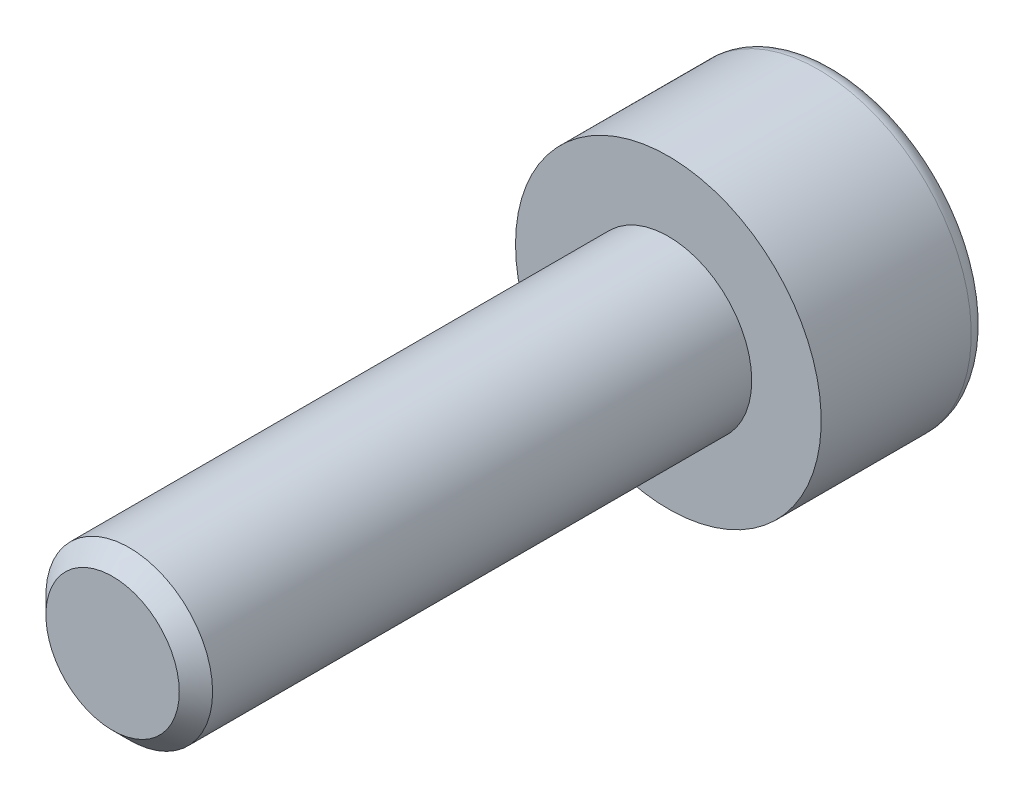
ISO-10303-21;
HEADER;
FILE_DESCRIPTION(('STEP AP214'),'2;1');
FILE_NAME('part.step','',(''),(''),'','','');
FILE_SCHEMA(('AUTOMOTIVE_DESIGN { 1 0 10303 214 1 1 1 1 }'));
ENDSEC;
DATA;
#1=APPLICATION_CONTEXT('core data for automotive mechanical design processes');
#2=APPLICATION_PROTOCOL_DEFINITION('international standard','automotive_design',2000,#1);
#3=PRODUCT_CONTEXT('',#1,'mechanical');
#4=PRODUCT('Part','Part','',(#3));
#5=PRODUCT_RELATED_PRODUCT_CATEGORY('part','',(#4));
#6=PRODUCT_DEFINITION_FORMATION('','',#4);
#7=PRODUCT_DEFINITION_CONTEXT('part definition',#1,'design');
#8=PRODUCT_DEFINITION('design','',#6,#7);
#9=PRODUCT_DEFINITION_SHAPE('','',#8);
#10=(LENGTH_UNIT() NAMED_UNIT(*) SI_UNIT(.MILLI.,.METRE.));
#11=(NAMED_UNIT(*) PLANE_ANGLE_UNIT() SI_UNIT($,.RADIAN.));
#12=(NAMED_UNIT(*) SI_UNIT($,.STERADIAN.) SOLID_ANGLE_UNIT());
#13=UNCERTAINTY_MEASURE_WITH_UNIT(LENGTH_MEASURE(1.E-05),#10,'distance_accuracy_value','');
#14=(GEOMETRIC_REPRESENTATION_CONTEXT(3) GLOBAL_UNCERTAINTY_ASSIGNED_CONTEXT((#13)) GLOBAL_UNIT_ASSIGNED_CONTEXT((#10,
#11,#12)) REPRESENTATION_CONTEXT('',''));
#15=CARTESIAN_POINT('',(0.,0.,0.));
#16=DIRECTION('',(0.,0.,1.));
#17=DIRECTION('',(1.,0.,0.));
#18=AXIS2_PLACEMENT_3D('',#15,#16,#17);
#19=CARTESIAN_POINT('',(0.,0.,-3.));
#20=DIRECTION('',(0.,0.,1.));
#21=DIRECTION('',(1.,0.,0.));
#22=AXIS2_PLACEMENT_3D('',#19,#20,#21);
#23=PLANE('',#22);
#24=CARTESIAN_POINT('',(0.,0.,-3.));
#25=DIRECTION('',(0.,0.,-1.));
#26=DIRECTION('',(-1.,0.,0.));
#27=AXIS2_PLACEMENT_3D('',#24,#25,#26);
#28=CIRCLE('',#27,2.45);
#29=CARTESIAN_POINT('',(-2.45,0.,-3.));
#30=VERTEX_POINT('',#29);
#31=EDGE_CURVE('E144',#30,#30,#28,.T.);
#32=ORIENTED_EDGE('',*,*,#31,.T.);
#33=EDGE_LOOP('',(#32));
#34=FACE_BOUND('',#33,.T.);
#35=DIRECTION('',(-0.86602540378444,0.499999999999998,0.));
#36=VECTOR('',#35,1.);
#37=CARTESIAN_POINT('',(0.,1.44337567297407,-3.));
#38=LINE('',#37,#36);
#39=CARTESIAN_POINT('',(1.25,0.721687836487036,-3.));
#40=VERTEX_POINT('',#39);
#41=CARTESIAN_POINT('',(0.,1.44337567297407,-3.));
#42=VERTEX_POINT('',#41);
#43=EDGE_CURVE('E46',#40,#42,#38,.T.);
#44=ORIENTED_EDGE('',*,*,#43,.T.);
#45=DIRECTION('',(-0.866025403784437,-0.500000000000002,0.));
#46=VECTOR('',#45,1.);
#47=CARTESIAN_POINT('',(0.,1.44337567297407,-3.));
#48=LINE('',#47,#46);
#49=CARTESIAN_POINT('',(-1.25,0.721687836487036,-3.));
#50=VERTEX_POINT('',#49);
#51=EDGE_CURVE('E117',#42,#50,#48,.T.);
#52=ORIENTED_EDGE('',*,*,#51,.T.);
#53=DIRECTION('',(0.,-1.,0.));
#54=VECTOR('',#53,1.);
#55=CARTESIAN_POINT('',(-1.25,-0.721687836487036,-3.));
#56=LINE('',#55,#54);
#57=CARTESIAN_POINT('',(-1.25,-0.721687836487036,-3.));
#58=VERTEX_POINT('',#57);
#59=EDGE_CURVE('E121',#50,#58,#56,.T.);
#60=ORIENTED_EDGE('',*,*,#59,.T.);
#61=DIRECTION('',(0.866025403784437,-0.500000000000002,0.));
#62=VECTOR('',#61,1.);
#63=CARTESIAN_POINT('',(0.,-1.44337567297407,-3.));
#64=LINE('',#63,#62);
#65=CARTESIAN_POINT('',(0.,-1.44337567297407,-3.));
#66=VERTEX_POINT('',#65);
#67=EDGE_CURVE('E124',#58,#66,#64,.T.);
#68=ORIENTED_EDGE('',*,*,#67,.T.);
#69=DIRECTION('',(0.86602540378444,0.499999999999998,0.));
#70=VECTOR('',#69,1.);
#71=CARTESIAN_POINT('',(0.,-1.44337567297407,-3.));
#72=LINE('',#71,#70);
#73=CARTESIAN_POINT('',(1.25,-0.721687836487036,-3.));
#74=VERTEX_POINT('',#73);
#75=EDGE_CURVE('E107',#66,#74,#72,.T.);
#76=ORIENTED_EDGE('',*,*,#75,.T.);
#77=DIRECTION('',(0.,1.,0.));
#78=VECTOR('',#77,1.);
#79=CARTESIAN_POINT('',(1.25,-0.721687836487036,-3.));
#80=LINE('',#79,#78);
#81=EDGE_CURVE('E127',#74,#40,#80,.T.);
#82=ORIENTED_EDGE('',*,*,#81,.T.);
#83=EDGE_LOOP('',(#44,#52,#60,#68,#76,#82));
#84=FACE_BOUND('',#83,.T.);
#85=ADVANCED_FACE('F31',(#34,#84),#23,.F.);
#86=CARTESIAN_POINT('',(0.,0.,-2.7));
#87=DIRECTION('',(0.,0.,-1.));
#88=DIRECTION('',(-1.,0.,0.));
#89=AXIS2_PLACEMENT_3D('',#86,#87,#88);
#90=TOROIDAL_SURFACE('',#89,2.45,0.299999999999999);
#91=ORIENTED_EDGE('',*,*,#31,.F.);
#92=EDGE_LOOP('',(#91));
#93=FACE_BOUND('',#92,.T.);
#94=CARTESIAN_POINT('',(0.,0.,-2.7));
#95=DIRECTION('',(0.,0.,-1.));
#96=DIRECTION('',(-1.,0.,0.));
#97=AXIS2_PLACEMENT_3D('',#94,#95,#96);
#98=CIRCLE('',#97,2.75);
#99=CARTESIAN_POINT('',(-2.75,0.,-2.7));
#100=VERTEX_POINT('',#99);
#101=EDGE_CURVE('E141',#100,#100,#98,.T.);
#102=ORIENTED_EDGE('',*,*,#101,.T.);
#103=EDGE_LOOP('',(#102));
#104=FACE_BOUND('',#103,.T.);
#105=ADVANCED_FACE('F161',(#93,#104),#90,.T.);
#106=CARTESIAN_POINT('',(0.,0.,0.));
#107=DIRECTION('',(0.,0.,-1.));
#108=DIRECTION('',(-1.,0.,0.));
#109=AXIS2_PLACEMENT_3D('',#106,#107,#108);
#110=CYLINDRICAL_SURFACE('',#109,2.75);
#111=ORIENTED_EDGE('',*,*,#101,.F.);
#112=EDGE_LOOP('',(#111));
#113=FACE_BOUND('',#112,.T.);
#114=CARTESIAN_POINT('',(0.,0.,0.));
#115=DIRECTION('',(0.,0.,-1.));
#116=DIRECTION('',(-1.,0.,0.));
#117=AXIS2_PLACEMENT_3D('',#114,#115,#116);
#118=CIRCLE('',#117,2.75);
#119=CARTESIAN_POINT('',(-2.75,0.,0.));
#120=VERTEX_POINT('',#119);
#121=EDGE_CURVE('E138',#120,#120,#118,.T.);
#122=ORIENTED_EDGE('',*,*,#121,.T.);
#123=EDGE_LOOP('',(#122));
#124=FACE_BOUND('',#123,.T.);
#125=ADVANCED_FACE('F166',(#113,#124),#110,.T.);
#126=CARTESIAN_POINT('',(0.,0.,0.));
#127=DIRECTION('',(0.,0.,-1.));
#128=DIRECTION('',(-1.,0.,0.));
#129=AXIS2_PLACEMENT_3D('',#126,#127,#128);
#130=PLANE('',#129);
#131=CARTESIAN_POINT('',(0.,0.,0.));
#132=DIRECTION('',(0.,0.,1.));
#133=DIRECTION('',(1.,0.,0.));
#134=AXIS2_PLACEMENT_3D('',#131,#132,#133);
#135=CIRCLE('',#134,1.5);
#136=CARTESIAN_POINT('',(1.5,0.,0.));
#137=VERTEX_POINT('',#136);
#138=EDGE_CURVE('E118',#137,#137,#135,.T.);
#139=ORIENTED_EDGE('',*,*,#138,.F.);
#140=EDGE_LOOP('',(#139));
#141=FACE_BOUND('',#140,.T.);
#142=ORIENTED_EDGE('',*,*,#121,.F.);
#143=EDGE_LOOP('',(#142));
#144=FACE_BOUND('',#143,.T.);
#145=ADVANCED_FACE('F173',(#141,#144),#130,.F.);
#146=CARTESIAN_POINT('',(0.,1.44337567297407,-1.7));
#147=DIRECTION('',(-0.499999999999998,-0.86602540378444,0.));
#148=DIRECTION('',(0.86602540378444,-0.499999999999998,0.));
#149=AXIS2_PLACEMENT_3D('',#146,#147,#148);
#150=PLANE('',#149);
#151=ORIENTED_EDGE('',*,*,#43,.F.);
#152=DIRECTION('',(0.,0.,-1.));
#153=VECTOR('',#152,1.);
#154=CARTESIAN_POINT('',(1.25,0.721687836487036,-1.7));
#155=LINE('',#154,#153);
#156=CARTESIAN_POINT('',(1.25,0.721687836487036,-1.7));
#157=VERTEX_POINT('',#156);
#158=EDGE_CURVE('E112',#157,#40,#155,.T.);
#159=ORIENTED_EDGE('',*,*,#158,.F.);
#160=DIRECTION('',(-0.86602540378444,0.499999999999998,0.));
#161=VECTOR('',#160,1.);
#162=CARTESIAN_POINT('',(0.,1.44337567297407,-1.7));
#163=LINE('',#162,#161);
#164=CARTESIAN_POINT('',(0.,1.44337567297407,-1.7));
#165=VERTEX_POINT('',#164);
#166=EDGE_CURVE('E130',#157,#165,#163,.T.);
#167=ORIENTED_EDGE('',*,*,#166,.T.);
#168=DIRECTION('',(0.,0.,-1.));
#169=VECTOR('',#168,1.);
#170=CARTESIAN_POINT('',(0.,1.44337567297407,-1.7));
#171=LINE('',#170,#169);
#172=EDGE_CURVE('E136',#165,#42,#171,.T.);
#173=ORIENTED_EDGE('',*,*,#172,.T.);
#174=EDGE_LOOP('',(#151,#159,#167,#173));
#175=FACE_BOUND('',#174,.T.);
#176=ADVANCED_FACE('F177',(#175),#150,.T.);
#177=CARTESIAN_POINT('',(0.,1.44337567297407,-1.7));
#178=DIRECTION('',(0.500000000000002,-0.866025403784437,0.));
#179=DIRECTION('',(0.866025403784437,0.500000000000002,0.));
#180=AXIS2_PLACEMENT_3D('',#177,#178,#179);
#181=PLANE('',#180);
#182=ORIENTED_EDGE('',*,*,#51,.F.);
#183=ORIENTED_EDGE('',*,*,#172,.F.);
#184=DIRECTION('',(-0.866025403784437,-0.500000000000002,0.));
#185=VECTOR('',#184,1.);
#186=CARTESIAN_POINT('',(0.,1.44337567297407,-1.7));
#187=LINE('',#186,#185);
#188=CARTESIAN_POINT('',(-1.25,0.721687836487036,-1.7));
#189=VERTEX_POINT('',#188);
#190=EDGE_CURVE('E85',#165,#189,#187,.T.);
#191=ORIENTED_EDGE('',*,*,#190,.T.);
#192=DIRECTION('',(0.,0.,-1.));
#193=VECTOR('',#192,1.);
#194=CARTESIAN_POINT('',(-1.25,0.721687836487036,-1.7));
#195=LINE('',#194,#193);
#196=EDGE_CURVE('E134',#189,#50,#195,.T.);
#197=ORIENTED_EDGE('',*,*,#196,.T.);
#198=EDGE_LOOP('',(#182,#183,#191,#197));
#199=FACE_BOUND('',#198,.T.);
#200=ADVANCED_FACE('F181',(#199),#181,.T.);
#201=CARTESIAN_POINT('',(-1.25,-0.721687836487036,-1.7));
#202=DIRECTION('',(1.,0.,0.));
#203=DIRECTION('',(0.,0.,-1.));
#204=AXIS2_PLACEMENT_3D('',#201,#202,#203);
#205=PLANE('',#204);
#206=ORIENTED_EDGE('',*,*,#59,.F.);
#207=ORIENTED_EDGE('',*,*,#196,.F.);
#208=DIRECTION('',(0.,-1.,0.));
#209=VECTOR('',#208,1.);
#210=CARTESIAN_POINT('',(-1.25,-0.721687836487036,-1.7));
#211=LINE('',#210,#209);
#212=CARTESIAN_POINT('',(-1.25,-0.721687836487036,-1.7));
#213=VERTEX_POINT('',#212);
#214=EDGE_CURVE('E103',#189,#213,#211,.T.);
#215=ORIENTED_EDGE('',*,*,#214,.T.);
#216=DIRECTION('',(0.,0.,-1.));
#217=VECTOR('',#216,1.);
#218=CARTESIAN_POINT('',(-1.25,-0.721687836487036,-1.7));
#219=LINE('',#218,#217);
#220=EDGE_CURVE('E100',#213,#58,#219,.T.);
#221=ORIENTED_EDGE('',*,*,#220,.T.);
#222=EDGE_LOOP('',(#206,#207,#215,#221));
#223=FACE_BOUND('',#222,.T.);
#224=ADVANCED_FACE('F184',(#223),#205,.T.);
#225=CARTESIAN_POINT('',(0.,-1.44337567297407,-1.7));
#226=DIRECTION('',(0.500000000000002,0.866025403784437,0.));
#227=DIRECTION('',(-0.866025403784437,0.500000000000002,0.));
#228=AXIS2_PLACEMENT_3D('',#225,#226,#227);
#229=PLANE('',#228);
#230=ORIENTED_EDGE('',*,*,#67,.F.);
#231=ORIENTED_EDGE('',*,*,#220,.F.);
#232=DIRECTION('',(0.866025403784437,-0.500000000000002,0.));
#233=VECTOR('',#232,1.);
#234=CARTESIAN_POINT('',(0.,-1.44337567297407,-1.7));
#235=LINE('',#234,#233);
#236=CARTESIAN_POINT('',(0.,-1.44337567297407,-1.7));
#237=VERTEX_POINT('',#236);
#238=EDGE_CURVE('E95',#213,#237,#235,.T.);
#239=ORIENTED_EDGE('',*,*,#238,.T.);
#240=DIRECTION('',(0.,0.,-1.));
#241=VECTOR('',#240,1.);
#242=CARTESIAN_POINT('',(0.,-1.44337567297407,-1.7));
#243=LINE('',#242,#241);
#244=EDGE_CURVE('E99',#237,#66,#243,.T.);
#245=ORIENTED_EDGE('',*,*,#244,.T.);
#246=EDGE_LOOP('',(#230,#231,#239,#245));
#247=FACE_BOUND('',#246,.T.);
#248=ADVANCED_FACE('F98',(#247),#229,.T.);
#249=CARTESIAN_POINT('',(0.,-1.44337567297407,-1.7));
#250=DIRECTION('',(-0.499999999999998,0.86602540378444,0.));
#251=DIRECTION('',(-0.86602540378444,-0.499999999999998,0.));
#252=AXIS2_PLACEMENT_3D('',#249,#250,#251);
#253=PLANE('',#252);
#254=ORIENTED_EDGE('',*,*,#75,.F.);
#255=ORIENTED_EDGE('',*,*,#244,.F.);
#256=DIRECTION('',(0.86602540378444,0.499999999999998,0.));
#257=VECTOR('',#256,1.);
#258=CARTESIAN_POINT('',(0.,-1.44337567297407,-1.7));
#259=LINE('',#258,#257);
#260=CARTESIAN_POINT('',(1.25,-0.721687836487036,-1.7));
#261=VERTEX_POINT('',#260);
#262=EDGE_CURVE('E102',#237,#261,#259,.T.);
#263=ORIENTED_EDGE('',*,*,#262,.T.);
#264=DIRECTION('',(0.,0.,-1.));
#265=VECTOR('',#264,1.);
#266=CARTESIAN_POINT('',(1.25,-0.721687836487036,-1.7));
#267=LINE('',#266,#265);
#268=EDGE_CURVE('E76',#261,#74,#267,.T.);
#269=ORIENTED_EDGE('',*,*,#268,.T.);
#270=EDGE_LOOP('',(#254,#255,#263,#269));
#271=FACE_BOUND('',#270,.T.);
#272=ADVANCED_FACE('F105',(#271),#253,.T.);
#273=CARTESIAN_POINT('',(1.25,-0.721687836487036,-1.7));
#274=DIRECTION('',(-1.,0.,0.));
#275=DIRECTION('',(0.,0.,1.));
#276=AXIS2_PLACEMENT_3D('',#273,#274,#275);
#277=PLANE('',#276);
#278=ORIENTED_EDGE('',*,*,#81,.F.);
#279=ORIENTED_EDGE('',*,*,#268,.F.);
#280=DIRECTION('',(0.,1.,0.));
#281=VECTOR('',#280,1.);
#282=CARTESIAN_POINT('',(1.25,-0.721687836487036,-1.7));
#283=LINE('',#282,#281);
#284=EDGE_CURVE('E54',#261,#157,#283,.T.);
#285=ORIENTED_EDGE('',*,*,#284,.T.);
#286=ORIENTED_EDGE('',*,*,#158,.T.);
#287=EDGE_LOOP('',(#278,#279,#285,#286));
#288=FACE_BOUND('',#287,.T.);
#289=ADVANCED_FACE('F193',(#288),#277,.T.);
#290=CARTESIAN_POINT('',(1.25,0.721687836487036,-1.7));
#291=DIRECTION('',(0.,0.,1.));
#292=DIRECTION('',(1.,0.,0.));
#293=AXIS2_PLACEMENT_3D('',#290,#291,#292);
#294=PLANE('',#293);
#295=ORIENTED_EDGE('',*,*,#166,.F.);
#296=ORIENTED_EDGE('',*,*,#284,.F.);
#297=ORIENTED_EDGE('',*,*,#262,.F.);
#298=ORIENTED_EDGE('',*,*,#238,.F.);
#299=ORIENTED_EDGE('',*,*,#214,.F.);
#300=ORIENTED_EDGE('',*,*,#190,.F.);
#301=EDGE_LOOP('',(#295,#296,#297,#298,#299,#300));
#302=FACE_BOUND('',#301,.T.);
#303=ADVANCED_FACE('F110',(#302),#294,.F.);
#304=CARTESIAN_POINT('',(0.,0.,10.));
#305=DIRECTION('',(0.,0.,1.));
#306=DIRECTION('',(1.,0.,0.));
#307=AXIS2_PLACEMENT_3D('',#304,#305,#306);
#308=PLANE('',#307);
#309=CARTESIAN_POINT('',(0.,0.,10.));
#310=DIRECTION('',(0.,0.,1.));
#311=DIRECTION('',(1.,0.,0.));
#312=AXIS2_PLACEMENT_3D('',#309,#310,#311);
#313=CIRCLE('',#312,1.2);
#314=CARTESIAN_POINT('',(1.2,0.,10.));
#315=VERTEX_POINT('',#314);
#316=EDGE_CURVE('E39',#315,#315,#313,.T.);
#317=ORIENTED_EDGE('',*,*,#316,.T.);
#318=EDGE_LOOP('',(#317));
#319=FACE_BOUND('',#318,.T.);
#320=ADVANCED_FACE('F149',(#319),#308,.T.);
#321=CARTESIAN_POINT('',(0.,0.,0.));
#322=DIRECTION('',(0.,0.,1.));
#323=DIRECTION('',(1.,0.,0.));
#324=AXIS2_PLACEMENT_3D('',#321,#322,#323);
#325=CYLINDRICAL_SURFACE('',#324,1.5);
#326=CARTESIAN_POINT('',(0.,0.,9.7));
#327=DIRECTION('',(0.,0.,1.));
#328=DIRECTION('',(1.,0.,0.));
#329=AXIS2_PLACEMENT_3D('',#326,#327,#328);
#330=CIRCLE('',#329,1.5);
#331=CARTESIAN_POINT('',(1.5,0.,9.7));
#332=VERTEX_POINT('',#331);
#333=EDGE_CURVE('E11',#332,#332,#330,.F.);
#334=ORIENTED_EDGE('',*,*,#333,.T.);
#335=EDGE_LOOP('',(#334));
#336=FACE_BOUND('',#335,.T.);
#337=ORIENTED_EDGE('',*,*,#138,.T.);
#338=EDGE_LOOP('',(#337));
#339=FACE_BOUND('',#338,.T.);
#340=ADVANCED_FACE('F152',(#336,#339),#325,.T.);
#341=CARTESIAN_POINT('',(0.,0.,10.));
#342=DIRECTION('',(0.,0.,-1.));
#343=DIRECTION('',(-1.,0.,0.));
#344=AXIS2_PLACEMENT_3D('',#341,#342,#343);
#345=CONICAL_SURFACE('',#344,1.2,0.785398163397448);
#346=ORIENTED_EDGE('',*,*,#333,.F.);
#347=EDGE_LOOP('',(#346));
#348=FACE_BOUND('',#347,.T.);
#349=ORIENTED_EDGE('',*,*,#316,.F.);
#350=EDGE_LOOP('',(#349));
#351=FACE_BOUND('',#350,.T.);
#352=ADVANCED_FACE('F33',(#348,#351),#345,.T.);
#353=CLOSED_SHELL('',(#85,#105,#125,#145,#176,#200,#224,#248,#272,#289,#303,#320,#340,#352));
#354=MANIFOLD_SOLID_BREP('B2',#353);
#355=ADVANCED_BREP_SHAPE_REPRESENTATION('',(#18,#354),#14);
#356=SHAPE_DEFINITION_REPRESENTATION(#9,#355);
ENDSEC;
END-ISO-10303-21;
